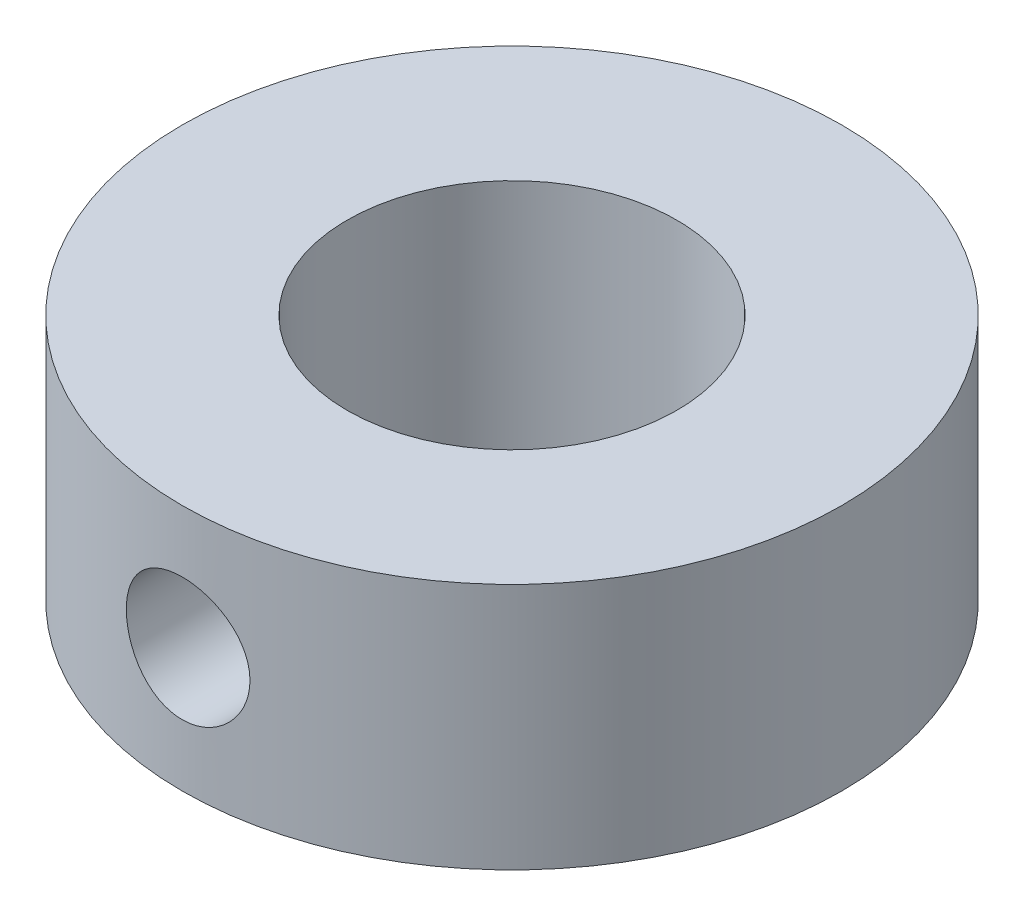
ISO-10303-21;
HEADER;
FILE_DESCRIPTION(('STEP AP214'),'2;1');
FILE_NAME('part.step','',(''),(''),'','','');
FILE_SCHEMA(('AUTOMOTIVE_DESIGN { 1 0 10303 214 1 1 1 1 }'));
ENDSEC;
DATA;
#1=APPLICATION_CONTEXT('core data for automotive mechanical design processes');
#2=APPLICATION_PROTOCOL_DEFINITION('international standard','automotive_design',2000,#1);
#3=PRODUCT_CONTEXT('',#1,'mechanical');
#4=PRODUCT('Part','Part','',(#3));
#5=PRODUCT_RELATED_PRODUCT_CATEGORY('part','',(#4));
#6=PRODUCT_DEFINITION_FORMATION('','',#4);
#7=PRODUCT_DEFINITION_CONTEXT('part definition',#1,'design');
#8=PRODUCT_DEFINITION('design','',#6,#7);
#9=PRODUCT_DEFINITION_SHAPE('','',#8);
#10=(LENGTH_UNIT() NAMED_UNIT(*) SI_UNIT(.MILLI.,.METRE.));
#11=(NAMED_UNIT(*) PLANE_ANGLE_UNIT() SI_UNIT($,.RADIAN.));
#12=(NAMED_UNIT(*) SI_UNIT($,.STERADIAN.) SOLID_ANGLE_UNIT());
#13=UNCERTAINTY_MEASURE_WITH_UNIT(LENGTH_MEASURE(1.E-05),#10,'distance_accuracy_value','');
#14=(GEOMETRIC_REPRESENTATION_CONTEXT(3) GLOBAL_UNCERTAINTY_ASSIGNED_CONTEXT((#13)) GLOBAL_UNIT_ASSIGNED_CONTEXT((#10,
#11,#12)) REPRESENTATION_CONTEXT('',''));
#15=CARTESIAN_POINT('',(0.,0.,0.));
#16=DIRECTION('',(0.,0.,1.));
#17=DIRECTION('',(1.,0.,0.));
#18=AXIS2_PLACEMENT_3D('',#15,#16,#17);
#19=CARTESIAN_POINT('',(0.,9.525,0.));
#20=DIRECTION('',(0.,-1.,0.));
#21=DIRECTION('',(0.,0.,-1.));
#22=AXIS2_PLACEMENT_3D('',#19,#20,#21);
#23=CYLINDRICAL_SURFACE('',#22,12.7);
#24=CARTESIAN_POINT('',(0.,9.525,0.));
#25=DIRECTION('',(0.,1.,0.));
#26=DIRECTION('',(0.,0.,1.));
#27=AXIS2_PLACEMENT_3D('',#24,#25,#26);
#28=CIRCLE('',#27,12.7);
#29=CARTESIAN_POINT('',(0.,9.525,12.7));
#30=VERTEX_POINT('',#29);
#31=EDGE_CURVE('E10',#30,#30,#28,.T.);
#32=ORIENTED_EDGE('',*,*,#31,.F.);
#33=EDGE_LOOP('',(#32));
#34=FACE_BOUND('',#33,.T.);
#35=CARTESIAN_POINT('',(0.,0.,0.));
#36=DIRECTION('',(0.,1.,0.));
#37=DIRECTION('',(0.,0.,1.));
#38=AXIS2_PLACEMENT_3D('',#35,#36,#37);
#39=CIRCLE('',#38,12.7);
#40=CARTESIAN_POINT('',(0.,0.,12.7));
#41=VERTEX_POINT('',#40);
#42=EDGE_CURVE('E42',#41,#41,#39,.T.);
#43=ORIENTED_EDGE('',*,*,#42,.T.);
#44=EDGE_LOOP('',(#43));
#45=FACE_BOUND('',#44,.T.);
#46=CARTESIAN_POINT('',(0.,2.38125,12.7));
#47=CARTESIAN_POINT('',(0.132511397513935,2.38125506347139,12.6999976002374));
#48=CARTESIAN_POINT('',(0.265088675959031,2.39234833413327,12.6979046575072));
#49=CARTESIAN_POINT('',(0.526507281123853,2.43639974225038,12.689757226012));
#50=CARTESIAN_POINT('',(0.655345358966658,2.46937633289058,12.6836993938995));
#51=CARTESIAN_POINT('',(0.905467076939734,2.55614916324921,12.6682998279016));
#52=CARTESIAN_POINT('',(1.02675742496298,2.60992660076841,12.6589610604004));
#53=CARTESIAN_POINT('',(1.25858265728673,2.73672121711497,12.6380194057716));
#54=CARTESIAN_POINT('',(1.36911841123275,2.8097368385174,12.6264167019403));
#55=CARTESIAN_POINT('',(1.57763164903967,2.97386338170583,12.6020724658343));
#56=CARTESIAN_POINT('',(1.67546171611303,3.06515999341384,12.5893200533446));
#57=CARTESIAN_POINT('',(1.85451124739899,3.2628575031765,12.5641944305311));
#58=CARTESIAN_POINT('',(1.93572951831671,3.36925948538374,12.5518212475031));
#59=CARTESIAN_POINT('',(2.07986310381946,3.5951891652778,12.5287492510145));
#60=CARTESIAN_POINT('',(2.14262846126748,3.71481408787861,12.5180644654431));
#61=CARTESIAN_POINT('',(2.24711457377499,3.96314440284315,12.4997323222403));
#62=CARTESIAN_POINT('',(2.28883714369543,4.09184901102656,12.4920847026768));
#63=CARTESIAN_POINT('',(2.34958022436806,4.35310792907663,12.480802279496));
#64=CARTESIAN_POINT('',(2.36885781929862,4.4856004668105,12.4771220701917));
#65=CARTESIAN_POINT('',(2.38496170351362,4.75198659838309,12.4740542548001));
#66=CARTESIAN_POINT('',(2.38179000614906,4.8858800655049,12.4746662637678));
#67=CARTESIAN_POINT('',(2.3532938011875,5.14940474635985,12.4800723966403));
#68=CARTESIAN_POINT('',(2.32826163118721,5.27906887145149,12.4848113293389));
#69=CARTESIAN_POINT('',(2.25721544041479,5.53232386640489,12.4978506596441));
#70=CARTESIAN_POINT('',(2.21120052805205,5.65591447794601,12.5061512085886));
#71=CARTESIAN_POINT('',(2.09920914897138,5.89436952791292,12.5254362027698));
#72=CARTESIAN_POINT('',(2.03311463982774,6.00917719704703,12.5364364431959));
#73=CARTESIAN_POINT('',(1.88292373177036,6.22618250655762,12.5598709241963));
#74=CARTESIAN_POINT('',(1.7988255058671,6.32837886549725,12.5723053102464));
#75=CARTESIAN_POINT('',(1.6134382527541,6.51894961713003,12.5974475201956));
#76=CARTESIAN_POINT('',(1.51189918101633,6.60708078576714,12.6101565650065));
#77=CARTESIAN_POINT('',(1.29534925889439,6.76509511957221,12.6342360044695));
#78=CARTESIAN_POINT('',(1.18033827345603,6.83497810178179,12.6456063856995));
#79=CARTESIAN_POINT('',(0.939855544838535,6.95454818426865,12.6657503173805));
#80=CARTESIAN_POINT('',(0.814370933558808,7.00420998684966,12.6745206112886));
#81=CARTESIAN_POINT('',(0.556639595695431,7.0816820727838,12.6884510232682));
#82=CARTESIAN_POINT('',(0.424393589040987,7.109494677422,12.6936115248419));
#83=CARTESIAN_POINT('',(0.158985986484124,7.1421403242415,12.6996882251914));
#84=CARTESIAN_POINT('',(0.02586674505669,7.14730662155344,12.7006659707324));
#85=CARTESIAN_POINT('',(-0.239333481346342,7.13540692621811,12.6984370046219));
#86=CARTESIAN_POINT('',(-0.371414517012611,7.1183420258839,12.6952304985603));
#87=CARTESIAN_POINT('',(-0.629731997483919,7.0627414066464,12.685031645069));
#88=CARTESIAN_POINT('',(-0.756006014410625,7.02437431397122,12.6780690426877));
#89=CARTESIAN_POINT('',(-1.0003292030216,6.92744089048868,12.6611354951234));
#90=CARTESIAN_POINT('',(-1.11837781561973,6.86887318823932,12.6511643456924));
#91=CARTESIAN_POINT('',(-1.34432146602723,6.73246347154678,12.629166231928));
#92=CARTESIAN_POINT('',(-1.4520914522615,6.65441782757277,12.6171179930212));
#93=CARTESIAN_POINT('',(-1.65312458818246,6.48154320693726,12.5923570778992));
#94=CARTESIAN_POINT('',(-1.74638638174537,6.38671266311039,12.5796443397194));
#95=CARTESIAN_POINT('',(-1.91702207196876,6.18145144372811,12.554783051697));
#96=CARTESIAN_POINT('',(-1.9941685449699,6.07083033335095,12.5426442355316));
#97=CARTESIAN_POINT('',(-2.12878471654237,5.83800327106855,12.5205011460592));
#98=CARTESIAN_POINT('',(-2.18625514637104,5.71579774991188,12.5104967934304));
#99=CARTESIAN_POINT('',(-2.27956544201606,5.46384818575247,12.493831759327));
#100=CARTESIAN_POINT('',(-2.31550954211723,5.33414385994956,12.4871549919354));
#101=CARTESIAN_POINT('',(-2.36506828430399,5.07040003424728,12.4778643603633));
#102=CARTESIAN_POINT('',(-2.37868544567249,4.93636102519699,12.4752500377944));
#103=CARTESIAN_POINT('',(-2.38311947410513,4.6700307738366,12.4744035468862));
#104=CARTESIAN_POINT('',(-2.37429508318054,4.53774559023077,12.4761024285919));
#105=CARTESIAN_POINT('',(-2.3348819091385,4.27657986750311,12.4835380354775));
#106=CARTESIAN_POINT('',(-2.30429325604315,4.14769930804644,12.489274736535));
#107=CARTESIAN_POINT('',(-2.2223712153843,3.89719425538718,12.504110564868));
#108=CARTESIAN_POINT('',(-2.17107667443138,3.77555666123859,12.5132033929451));
#109=CARTESIAN_POINT('',(-2.04923816898124,3.54255664639266,12.5337314023855));
#110=CARTESIAN_POINT('',(-1.97869284455245,3.43119495235891,12.5451667492169));
#111=CARTESIAN_POINT('',(-1.81910811151512,3.22011090793286,12.5693053494604));
#112=CARTESIAN_POINT('',(-1.72980762534582,3.12058778254972,12.5820250224796));
#113=CARTESIAN_POINT('',(-1.53579183370339,2.93781930458757,12.6071762384599));
#114=CARTESIAN_POINT('',(-1.43107299175294,2.85457769669403,12.6196077145588));
#115=CARTESIAN_POINT('',(-1.2080636003016,2.70603511270454,12.6429131184928));
#116=CARTESIAN_POINT('',(-1.08965935014182,2.64090240727111,12.6537720157252));
#117=CARTESIAN_POINT('',(-0.843423055425461,2.53155825188935,12.6725619576684));
#118=CARTESIAN_POINT('',(-0.715599997082081,2.48732715156303,12.6804957508297));
#119=CARTESIAN_POINT('',(-0.489501184484931,2.43002226336035,12.6909241149837));
#120=CARTESIAN_POINT('',(-0.392547173774844,2.41176392437843,12.6943083501915));
#121=CARTESIAN_POINT('',(-0.197074229795313,2.38737606389014,12.6988471567699));
#122=CARTESIAN_POINT('',(-0.0985553363736762,2.38124623404375,12.7000017848232));
#123=CARTESIAN_POINT('',(0.,2.38125,12.7));
#124=B_SPLINE_CURVE_WITH_KNOTS('',3,(#46,#47,#48,#49,#50,#51,#52,#53,#54,#55,#56,#57,#58,#59,
#60,#61,#62,#63,#64,#65,#66,#67,#68,#69,#70,#71,#72,#73,#74,#75,#76,#77,#78,#79,#80,#81,#82,#83,
#84,#85,#86,#87,#88,#89,#90,#91,#92,#93,#94,#95,#96,#97,#98,#99,#100,#101,#102,#103,#104,#105,
#106,#107,#108,#109,#110,#111,#112,#113,#114,#115,#116,#117,#118,#119,#120,#121,#122,#123),
.UNSPECIFIED.,.T.,.F.,(4,2,2,2,2,2,2,2,2,2,2,2,2,2,2,2,2,2,2,2,2,2,2,2,2,2,2,2,2,2,2,2,2,2,2,2,
2,2,4),(0.,0.397173769031817,0.79468288252503,1.19183351807906,1.58895201222314,
1.99032999846638,2.39173680725241,2.79632077425667,3.20086984145218,3.6007381541947,
4.00057060544769,4.39513663472765,4.78971943131774,5.1866682942438,5.58365745804152,
5.98690332436722,6.39015323352604,6.79390608960697,7.19761604469571,7.59536476345803,
7.99309393987526,8.38771871328677,8.78237028349125,9.18133447603112,9.58033593855793,
9.98463581217336,10.3889206584097,10.7912317166196,11.1934973765259,11.589373129179,
11.9852465168464,12.3803806272971,12.7755426584048,13.1766209982163,13.5777914762883,
13.9825737765465,14.3869747650324,14.682380219325,14.9777781635027),.UNSPECIFIED.);
#125=CARTESIAN_POINT('',(0.,2.38125,12.7));
#126=VERTEX_POINT('',#125);
#127=EDGE_CURVE('E52',#126,#126,#124,.T.);
#128=ORIENTED_EDGE('',*,*,#127,.F.);
#129=EDGE_LOOP('',(#128));
#130=FACE_BOUND('',#129,.T.);
#131=ADVANCED_FACE('F30',(#34,#45,#130),#23,.T.);
#132=CARTESIAN_POINT('',(0.,9.525,0.));
#133=DIRECTION('',(0.,-1.,0.));
#134=DIRECTION('',(0.,0.,-1.));
#135=AXIS2_PLACEMENT_3D('',#132,#133,#134);
#136=CYLINDRICAL_SURFACE('',#135,6.35);
#137=CARTESIAN_POINT('',(0.,0.,0.));
#138=DIRECTION('',(0.,1.,0.));
#139=DIRECTION('',(0.,0.,1.));
#140=AXIS2_PLACEMENT_3D('',#137,#138,#139);
#141=CIRCLE('',#140,6.35);
#142=CARTESIAN_POINT('',(0.,0.,6.35));
#143=VERTEX_POINT('',#142);
#144=EDGE_CURVE('E49',#143,#143,#141,.T.);
#145=ORIENTED_EDGE('',*,*,#144,.F.);
#146=EDGE_LOOP('',(#145));
#147=FACE_BOUND('',#146,.T.);
#148=CARTESIAN_POINT('',(0.,9.525,0.));
#149=DIRECTION('',(0.,1.,0.));
#150=DIRECTION('',(0.,0.,1.));
#151=AXIS2_PLACEMENT_3D('',#148,#149,#150);
#152=CIRCLE('',#151,6.35);
#153=CARTESIAN_POINT('',(0.,9.525,6.35));
#154=VERTEX_POINT('',#153);
#155=EDGE_CURVE('E47',#154,#154,#152,.T.);
#156=ORIENTED_EDGE('',*,*,#155,.T.);
#157=EDGE_LOOP('',(#156));
#158=FACE_BOUND('',#157,.T.);
#159=CARTESIAN_POINT('',(-2.38125,4.7625,5.88660754913218));
#160=CARTESIAN_POINT('',(-2.3812548276771,4.63390061956005,5.88660304464586));
#161=CARTESIAN_POINT('',(-2.37079786106945,4.50533306043109,5.89086737985199));
#162=CARTESIAN_POINT('',(-2.32943698281314,4.25207416828892,5.90734402750452));
#163=CARTESIAN_POINT('',(-2.29853368354584,4.12738271930073,5.91955610191063));
#164=CARTESIAN_POINT('',(-2.21757331457698,3.88560409759386,5.95035449984895));
#165=CARTESIAN_POINT('',(-2.16756213785573,3.76849948507455,5.96892553951658));
#166=CARTESIAN_POINT('',(-2.04996822578787,3.54429711379195,6.01032475542514));
#167=CARTESIAN_POINT('',(-1.98238021250807,3.43720237392427,6.03315420979015));
#168=CARTESIAN_POINT('',(-1.82795324931552,3.2307366303011,6.08176924784809));
#169=CARTESIAN_POINT('',(-1.74038230176142,3.13193345921396,6.10764180304523));
#170=CARTESIAN_POINT('',(-1.55002839564886,2.95001503170839,6.15870229122016));
#171=CARTESIAN_POINT('',(-1.44724220053243,2.86690312168464,6.18389007718253));
#172=CARTESIAN_POINT('',(-1.22506526509449,2.71599102423089,6.23177687374503));
#173=CARTESIAN_POINT('',(-1.10522852921663,2.64880808388862,6.25436203442375));
#174=CARTESIAN_POINT('',(-0.854957287994814,2.53579126361666,6.29345337658423));
#175=CARTESIAN_POINT('',(-0.724526476606982,2.48994997946273,6.30996166594483));
#176=CARTESIAN_POINT('',(-0.462739329911974,2.42290934045781,6.33442181651724));
#177=CARTESIAN_POINT('',(-0.331665575684536,2.40073239143827,6.34271202903455));
#178=CARTESIAN_POINT('',(-0.0674121775242178,2.37851759349983,6.35101622396355));
#179=CARTESIAN_POINT('',(0.0657667675372592,2.37847254553031,6.3510328975867));
#180=CARTESIAN_POINT('',(0.323442874614846,2.39995354632595,6.3430033462242));
#181=CARTESIAN_POINT('',(0.448043582998669,2.42041251049369,6.33535597919687));
#182=CARTESIAN_POINT('',(0.691894758550258,2.48052576542062,6.31338073955014));
#183=CARTESIAN_POINT('',(0.811144846195734,2.5201814154662,6.29905239386406));
#184=CARTESIAN_POINT('',(1.04297006496854,2.61805809203519,6.26487458553275));
#185=CARTESIAN_POINT('',(1.15542281025559,2.67654088336278,6.24494781408072));
#186=CARTESIAN_POINT('',(1.36919749013314,2.81017995387622,6.20158954983306));
#187=CARTESIAN_POINT('',(1.47051581838197,2.88534161154348,6.17815692729156));
#188=CARTESIAN_POINT('',(1.66543114779447,3.05534581697134,6.12858390825938));
#189=CARTESIAN_POINT('',(1.75822950559803,3.15108259108271,6.10236529964929));
#190=CARTESIAN_POINT('',(1.92675502967106,3.35691637691032,6.05127156285321));
#191=CARTESIAN_POINT('',(2.00247790852875,3.46701698425245,6.02639677327079));
#192=CARTESIAN_POINT('',(2.13622908742984,3.70160465455891,5.98031416767475));
#193=CARTESIAN_POINT('',(2.19382733454475,3.82635679606735,5.95919999828174));
#194=CARTESIAN_POINT('',(2.28689637290442,4.08479025728892,5.92411246176146));
#195=CARTESIAN_POINT('',(2.32237947708612,4.21846656235603,5.91013512188252));
#196=CARTESIAN_POINT('',(2.36839429341513,4.48306184021117,5.8918411062766));
#197=CARTESIAN_POINT('',(2.38019464840504,4.61372601754788,5.88703396580673));
#198=CARTESIAN_POINT('',(2.38216893446936,4.87522735381827,5.88623631486231));
#199=CARTESIAN_POINT('',(2.37234826986178,5.00606446135713,5.8902436011628));
#200=CARTESIAN_POINT('',(2.3325095196341,5.257688751634,5.90612518339632));
#201=CARTESIAN_POINT('',(2.30347231605625,5.37865817802702,5.91761700994264));
#202=CARTESIAN_POINT('',(2.22725892241969,5.61395236224269,5.94671923185447));
#203=CARTESIAN_POINT('',(2.18007901604952,5.72827575317925,5.96433088071971));
#204=CARTESIAN_POINT('',(2.06692963987016,5.95179854544615,6.00450035946961));
#205=CARTESIAN_POINT('',(2.00032215468565,6.06064525126807,6.02721884616203));
#206=CARTESIAN_POINT('',(1.85088717106682,6.26606725849004,6.07477217692138));
#207=CARTESIAN_POINT('',(1.76805373618089,6.36263804721659,6.09960779368084));
#208=CARTESIAN_POINT('',(1.58230465368025,6.54711729244723,6.15049961403194));
#209=CARTESIAN_POINT('',(1.47844881711706,6.6340885364204,6.17653338854285));
#210=CARTESIAN_POINT('',(1.25697848640812,6.78948090854823,6.22537926504238));
#211=CARTESIAN_POINT('',(1.13936394764974,6.85790197655152,6.24819135658416));
#212=CARTESIAN_POINT('',(0.893788423031207,6.97380186421689,6.28800789805977));
#213=CARTESIAN_POINT('',(0.765864662490094,7.02135235902076,6.30503217874091));
#214=CARTESIAN_POINT('',(0.503049996443166,7.09399205698675,6.33141730781206));
#215=CARTESIAN_POINT('',(0.368162396648703,7.11909181560806,6.34078175737817));
#216=CARTESIAN_POINT('',(0.103720241622182,7.14497936437329,6.35045096615854));
#217=CARTESIAN_POINT('',(-0.025686969296592,7.14709880435615,6.351251917641));
#218=CARTESIAN_POINT('',(-0.282935023429723,7.13039093438044,6.34499762572143));
#219=CARTESIAN_POINT('',(-0.410776053676846,7.1115661507187,6.33794332982095));
#220=CARTESIAN_POINT('',(-0.658095344298689,7.05443907325388,6.31699729745986));
#221=CARTESIAN_POINT('',(-0.777701535571776,7.01662314941811,6.30327656312599));
#222=CARTESIAN_POINT('',(-1.00888081339765,6.92307160375233,6.27043106498325));
#223=CARTESIAN_POINT('',(-1.12045237439993,6.86733258975371,6.2513052782838));
#224=CARTESIAN_POINT('',(-1.33753253097863,6.7368516146861,6.20856356551353));
#225=CARTESIAN_POINT('',(-1.44258910879436,6.66140933318377,6.18479268672709));
#226=CARTESIAN_POINT('',(-1.63896253919335,6.4947675695772,6.13567968465621));
#227=CARTESIAN_POINT('',(-1.73027446561878,6.40356246303009,6.11033700260226));
#228=CARTESIAN_POINT('',(-1.90152677599957,6.20226069101337,6.05929905960721));
#229=CARTESIAN_POINT('',(-1.98061262207925,6.09142101157966,6.03365578490952));
#230=CARTESIAN_POINT('',(-2.11906976421504,5.85721480705271,5.98643590944115));
#231=CARTESIAN_POINT('',(-2.1784390149413,5.73384698406646,5.96485973067694));
#232=CARTESIAN_POINT('',(-2.2775209557158,5.47218285645012,5.92776103388785));
#233=CARTESIAN_POINT('',(-2.31625779602771,5.33346919315711,5.91254537711765));
#234=CARTESIAN_POINT('',(-2.36811116296522,5.05065463077562,5.89197441021367));
#235=CARTESIAN_POINT('',(-2.38124459202396,4.90655734984317,5.8866125950691));
#236=CARTESIAN_POINT('',(-2.38125,4.7625,5.88660754913218));
#237=B_SPLINE_CURVE_WITH_KNOTS('',3,(#159,#160,#161,#162,#163,#164,#165,#166,#167,#168,#169,
#170,#171,#172,#173,#174,#175,#176,#177,#178,#179,#180,#181,#182,#183,#184,#185,#186,#187,#188,
#189,#190,#191,#192,#193,#194,#195,#196,#197,#198,#199,#200,#201,#202,#203,#204,#205,#206,#207,
#208,#209,#210,#211,#212,#213,#214,#215,#216,#217,#218,#219,#220,#221,#222,#223,#224,#225,#226,
#227,#228,#229,#230,#231,#232,#233,#234,#235,#236),.UNSPECIFIED.,.T.,.F.,(4,2,2,2,2,2,2,2,2,2,2,
2,2,2,2,2,2,2,2,2,2,2,2,2,2,2,2,2,2,2,2,2,2,2,2,2,2,2,4),(0.,0.385261709543381,
0.770511880762963,1.15484252268907,1.53928870408394,1.94111010695519,2.34301710765213,
2.75859989525297,3.1740383938909,3.57155779361094,3.96894788838939,4.34667775583799,
4.72443437364273,5.10768808305663,5.49106556144727,5.89687471675804,6.30278565184622,
6.71770615213411,7.13239543236905,7.5242048167861,7.91591627695444,8.28903355426605,
8.66222730084963,9.04940978112331,9.43673418205928,9.84861214492968,10.2604914433525,
10.6709449537873,11.0812053834229,11.4675558138861,11.8538596477276,12.2307393499677,
12.6076904234221,13.0004871385281,13.3934243006135,13.8071002678864,14.2208191350457,
14.6526754647319,15.0842466020344),.UNSPECIFIED.);
#238=CARTESIAN_POINT('',(-2.38125,4.7625,5.88660754913218));
#239=VERTEX_POINT('',#238);
#240=EDGE_CURVE('E34',#239,#239,#237,.T.);
#241=ORIENTED_EDGE('',*,*,#240,.T.);
#242=EDGE_LOOP('',(#241));
#243=FACE_BOUND('',#242,.T.);
#244=ADVANCED_FACE('F63',(#147,#158,#243),#136,.F.);
#245=CARTESIAN_POINT('',(0.,9.525,0.));
#246=DIRECTION('',(0.,1.,0.));
#247=DIRECTION('',(0.,0.,1.));
#248=AXIS2_PLACEMENT_3D('',#245,#246,#247);
#249=PLANE('',#248);
#250=ORIENTED_EDGE('',*,*,#31,.T.);
#251=EDGE_LOOP('',(#250));
#252=FACE_BOUND('',#251,.T.);
#253=ORIENTED_EDGE('',*,*,#155,.F.);
#254=EDGE_LOOP('',(#253));
#255=FACE_BOUND('',#254,.T.);
#256=ADVANCED_FACE('F68',(#252,#255),#249,.T.);
#257=CARTESIAN_POINT('',(0.,0.,0.));
#258=DIRECTION('',(0.,1.,0.));
#259=DIRECTION('',(0.,0.,1.));
#260=AXIS2_PLACEMENT_3D('',#257,#258,#259);
#261=PLANE('',#260);
#262=ORIENTED_EDGE('',*,*,#42,.F.);
#263=EDGE_LOOP('',(#262));
#264=FACE_BOUND('',#263,.T.);
#265=ORIENTED_EDGE('',*,*,#144,.T.);
#266=EDGE_LOOP('',(#265));
#267=FACE_BOUND('',#266,.T.);
#268=ADVANCED_FACE('F61',(#264,#267),#261,.F.);
#269=CARTESIAN_POINT('',(0.,4.7625,12.7));
#270=DIRECTION('',(0.,0.,-1.));
#271=DIRECTION('',(-1.,0.,0.));
#272=AXIS2_PLACEMENT_3D('',#269,#270,#271);
#273=CYLINDRICAL_SURFACE('',#272,2.38125);
#274=ORIENTED_EDGE('',*,*,#240,.F.);
#275=EDGE_LOOP('',(#274));
#276=FACE_BOUND('',#275,.T.);
#277=ORIENTED_EDGE('',*,*,#127,.T.);
#278=EDGE_LOOP('',(#277));
#279=FACE_BOUND('',#278,.T.);
#280=ADVANCED_FACE('F58',(#276,#279),#273,.F.);
#281=CLOSED_SHELL('',(#131,#244,#256,#268,#280));
#282=MANIFOLD_SOLID_BREP('B2',#281);
#283=ADVANCED_BREP_SHAPE_REPRESENTATION('',(#18,#282),#14);
#284=SHAPE_DEFINITION_REPRESENTATION(#9,#283);
ENDSEC;
END-ISO-10303-21;
